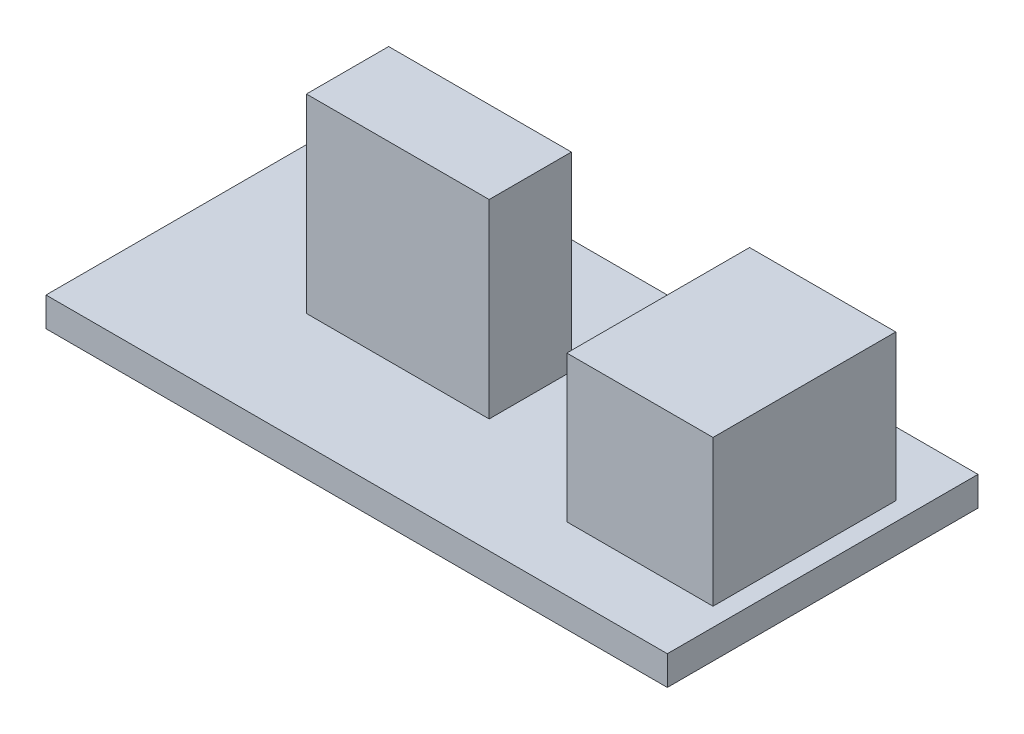
ISO-10303-21;
HEADER;
FILE_DESCRIPTION(('STEP AP214'),'2;1');
FILE_NAME('part.step','',(''),(''),'','','');
FILE_SCHEMA(('AUTOMOTIVE_DESIGN { 1 0 10303 214 1 1 1 1 }'));
ENDSEC;
DATA;
#1=APPLICATION_CONTEXT('core data for automotive mechanical design processes');
#2=APPLICATION_PROTOCOL_DEFINITION('international standard','automotive_design',2000,#1);
#3=PRODUCT_CONTEXT('',#1,'mechanical');
#4=PRODUCT('Part','Part','',(#3));
#5=PRODUCT_RELATED_PRODUCT_CATEGORY('part','',(#4));
#6=PRODUCT_DEFINITION_FORMATION('','',#4);
#7=PRODUCT_DEFINITION_CONTEXT('part definition',#1,'design');
#8=PRODUCT_DEFINITION('design','',#6,#7);
#9=PRODUCT_DEFINITION_SHAPE('','',#8);
#10=(LENGTH_UNIT() NAMED_UNIT(*) SI_UNIT(.MILLI.,.METRE.));
#11=(NAMED_UNIT(*) PLANE_ANGLE_UNIT() SI_UNIT($,.RADIAN.));
#12=(NAMED_UNIT(*) SI_UNIT($,.STERADIAN.) SOLID_ANGLE_UNIT());
#13=UNCERTAINTY_MEASURE_WITH_UNIT(LENGTH_MEASURE(1.E-05),#10,'distance_accuracy_value','');
#14=(GEOMETRIC_REPRESENTATION_CONTEXT(3) GLOBAL_UNCERTAINTY_ASSIGNED_CONTEXT((#13)) GLOBAL_UNIT_ASSIGNED_CONTEXT((#10,
#11,#12)) REPRESENTATION_CONTEXT('',''));
#15=CARTESIAN_POINT('',(0.,0.,0.));
#16=DIRECTION('',(0.,0.,1.));
#17=DIRECTION('',(1.,0.,0.));
#18=AXIS2_PLACEMENT_3D('',#15,#16,#17);
#19=CARTESIAN_POINT('',(0.,1.6,0.));
#20=DIRECTION('',(0.,-1.,0.));
#21=DIRECTION('',(0.,0.,-1.));
#22=AXIS2_PLACEMENT_3D('',#19,#20,#21);
#23=PLANE('',#22);
#24=DIRECTION('',(0.,0.,1.));
#25=VECTOR('',#24,1.);
#26=CARTESIAN_POINT('',(-9.,1.6,-2.25));
#27=LINE('',#26,#25);
#28=CARTESIAN_POINT('',(-9.,1.6,-2.25));
#29=VERTEX_POINT('',#28);
#30=CARTESIAN_POINT('',(-9.,1.6,2.25));
#31=VERTEX_POINT('',#30);
#32=EDGE_CURVE('E160',#29,#31,#27,.T.);
#33=ORIENTED_EDGE('',*,*,#32,.F.);
#34=DIRECTION('',(-1.,0.,0.));
#35=VECTOR('',#34,1.);
#36=CARTESIAN_POINT('',(1.,1.6,-2.25));
#37=LINE('',#36,#35);
#38=CARTESIAN_POINT('',(1.,1.6,-2.25));
#39=VERTEX_POINT('',#38);
#40=EDGE_CURVE('E168',#39,#29,#37,.T.);
#41=ORIENTED_EDGE('',*,*,#40,.F.);
#42=DIRECTION('',(0.,0.,-1.));
#43=VECTOR('',#42,1.);
#44=CARTESIAN_POINT('',(1.,1.6,2.25));
#45=LINE('',#44,#43);
#46=CARTESIAN_POINT('',(1.,1.6,2.25));
#47=VERTEX_POINT('',#46);
#48=EDGE_CURVE('E176',#47,#39,#45,.T.);
#49=ORIENTED_EDGE('',*,*,#48,.F.);
#50=DIRECTION('',(1.,0.,0.));
#51=VECTOR('',#50,1.);
#52=CARTESIAN_POINT('',(-9.,1.6,2.25));
#53=LINE('',#52,#51);
#54=EDGE_CURVE('E159',#31,#47,#53,.T.);
#55=ORIENTED_EDGE('',*,*,#54,.F.);
#56=EDGE_LOOP('',(#33,#41,#49,#55));
#57=FACE_BOUND('',#56,.T.);
#58=DIRECTION('',(0.,0.,-1.));
#59=VECTOR('',#58,1.);
#60=CARTESIAN_POINT('',(17.,1.6,8.5));
#61=LINE('',#60,#59);
#62=CARTESIAN_POINT('',(17.,1.6,8.5));
#63=VERTEX_POINT('',#62);
#64=CARTESIAN_POINT('',(17.,1.6,-8.5));
#65=VERTEX_POINT('',#64);
#66=EDGE_CURVE('E198',#63,#65,#61,.T.);
#67=ORIENTED_EDGE('',*,*,#66,.T.);
#68=DIRECTION('',(-1.,0.,0.));
#69=VECTOR('',#68,1.);
#70=CARTESIAN_POINT('',(-17.,1.6,-8.5));
#71=LINE('',#70,#69);
#72=CARTESIAN_POINT('',(-17.,1.6,-8.5));
#73=VERTEX_POINT('',#72);
#74=EDGE_CURVE('E200',#65,#73,#71,.T.);
#75=ORIENTED_EDGE('',*,*,#74,.T.);
#76=DIRECTION('',(0.,0.,1.));
#77=VECTOR('',#76,1.);
#78=CARTESIAN_POINT('',(-17.,1.6,8.5));
#79=LINE('',#78,#77);
#80=CARTESIAN_POINT('',(-17.,1.6,8.5));
#81=VERTEX_POINT('',#80);
#82=EDGE_CURVE('E205',#73,#81,#79,.T.);
#83=ORIENTED_EDGE('',*,*,#82,.T.);
#84=DIRECTION('',(1.,0.,0.));
#85=VECTOR('',#84,1.);
#86=CARTESIAN_POINT('',(-17.,1.6,8.5));
#87=LINE('',#86,#85);
#88=EDGE_CURVE('E204',#81,#63,#87,.T.);
#89=ORIENTED_EDGE('',*,*,#88,.T.);
#90=EDGE_LOOP('',(#67,#75,#83,#89));
#91=FACE_BOUND('',#90,.T.);
#92=DIRECTION('',(0.,0.,1.));
#93=VECTOR('',#92,1.);
#94=CARTESIAN_POINT('',(8.,1.6,-5.));
#95=LINE('',#94,#93);
#96=CARTESIAN_POINT('',(8.,1.6,-5.));
#97=VERTEX_POINT('',#96);
#98=CARTESIAN_POINT('',(8.,1.6,5.));
#99=VERTEX_POINT('',#98);
#100=EDGE_CURVE('E156',#97,#99,#95,.T.);
#101=ORIENTED_EDGE('',*,*,#100,.F.);
#102=DIRECTION('',(-1.,0.,0.));
#103=VECTOR('',#102,1.);
#104=CARTESIAN_POINT('',(16.,1.6,-5.));
#105=LINE('',#104,#103);
#106=CARTESIAN_POINT('',(16.,1.6,-5.));
#107=VERTEX_POINT('',#106);
#108=EDGE_CURVE('E153',#107,#97,#105,.T.);
#109=ORIENTED_EDGE('',*,*,#108,.F.);
#110=DIRECTION('',(0.,0.,-1.));
#111=VECTOR('',#110,1.);
#112=CARTESIAN_POINT('',(16.,1.6,5.));
#113=LINE('',#112,#111);
#114=CARTESIAN_POINT('',(16.,1.6,5.));
#115=VERTEX_POINT('',#114);
#116=EDGE_CURVE('E69',#115,#107,#113,.T.);
#117=ORIENTED_EDGE('',*,*,#116,.F.);
#118=DIRECTION('',(1.,0.,0.));
#119=VECTOR('',#118,1.);
#120=CARTESIAN_POINT('',(8.,1.6,5.));
#121=LINE('',#120,#119);
#122=EDGE_CURVE('E65',#99,#115,#121,.T.);
#123=ORIENTED_EDGE('',*,*,#122,.F.);
#124=EDGE_LOOP('',(#101,#109,#117,#123));
#125=FACE_BOUND('',#124,.T.);
#126=ADVANCED_FACE('F50',(#57,#91,#125),#23,.F.);
#127=CARTESIAN_POINT('',(17.,1.6,8.5));
#128=DIRECTION('',(-1.,0.,0.));
#129=DIRECTION('',(0.,0.,1.));
#130=AXIS2_PLACEMENT_3D('',#127,#128,#129);
#131=PLANE('',#130);
#132=DIRECTION('',(0.,0.,-1.));
#133=VECTOR('',#132,1.);
#134=CARTESIAN_POINT('',(17.,0.,8.5));
#135=LINE('',#134,#133);
#136=CARTESIAN_POINT('',(17.,0.,8.5));
#137=VERTEX_POINT('',#136);
#138=CARTESIAN_POINT('',(17.,0.,-8.5));
#139=VERTEX_POINT('',#138);
#140=EDGE_CURVE('E193',#137,#139,#135,.T.);
#141=ORIENTED_EDGE('',*,*,#140,.T.);
#142=DIRECTION('',(0.,-1.,0.));
#143=VECTOR('',#142,1.);
#144=CARTESIAN_POINT('',(17.,1.6,-8.5));
#145=LINE('',#144,#143);
#146=EDGE_CURVE('E11',#65,#139,#145,.T.);
#147=ORIENTED_EDGE('',*,*,#146,.F.);
#148=ORIENTED_EDGE('',*,*,#66,.F.);
#149=DIRECTION('',(0.,-1.,0.));
#150=VECTOR('',#149,1.);
#151=CARTESIAN_POINT('',(17.,1.6,8.5));
#152=LINE('',#151,#150);
#153=EDGE_CURVE('E206',#63,#137,#152,.T.);
#154=ORIENTED_EDGE('',*,*,#153,.T.);
#155=EDGE_LOOP('',(#141,#147,#148,#154));
#156=FACE_BOUND('',#155,.T.);
#157=ADVANCED_FACE('F47',(#156),#131,.F.);
#158=CARTESIAN_POINT('',(-17.,1.6,-8.5));
#159=DIRECTION('',(0.,0.,1.));
#160=DIRECTION('',(1.,0.,0.));
#161=AXIS2_PLACEMENT_3D('',#158,#159,#160);
#162=PLANE('',#161);
#163=DIRECTION('',(-1.,0.,0.));
#164=VECTOR('',#163,1.);
#165=CARTESIAN_POINT('',(-17.,0.,-8.5));
#166=LINE('',#165,#164);
#167=CARTESIAN_POINT('',(-17.,0.,-8.5));
#168=VERTEX_POINT('',#167);
#169=EDGE_CURVE('E207',#139,#168,#166,.T.);
#170=ORIENTED_EDGE('',*,*,#169,.T.);
#171=DIRECTION('',(0.,-1.,0.));
#172=VECTOR('',#171,1.);
#173=CARTESIAN_POINT('',(-17.,1.6,-8.5));
#174=LINE('',#173,#172);
#175=EDGE_CURVE('E54',#73,#168,#174,.T.);
#176=ORIENTED_EDGE('',*,*,#175,.F.);
#177=ORIENTED_EDGE('',*,*,#74,.F.);
#178=ORIENTED_EDGE('',*,*,#146,.T.);
#179=EDGE_LOOP('',(#170,#176,#177,#178));
#180=FACE_BOUND('',#179,.T.);
#181=ADVANCED_FACE('F236',(#180),#162,.F.);
#182=CARTESIAN_POINT('',(-17.,1.6,8.5));
#183=DIRECTION('',(1.,0.,0.));
#184=DIRECTION('',(0.,0.,-1.));
#185=AXIS2_PLACEMENT_3D('',#182,#183,#184);
#186=PLANE('',#185);
#187=DIRECTION('',(0.,0.,1.));
#188=VECTOR('',#187,1.);
#189=CARTESIAN_POINT('',(-17.,0.,8.5));
#190=LINE('',#189,#188);
#191=CARTESIAN_POINT('',(-17.,0.,8.5));
#192=VERTEX_POINT('',#191);
#193=EDGE_CURVE('E211',#168,#192,#190,.T.);
#194=ORIENTED_EDGE('',*,*,#193,.T.);
#195=DIRECTION('',(0.,-1.,0.));
#196=VECTOR('',#195,1.);
#197=CARTESIAN_POINT('',(-17.,1.6,8.5));
#198=LINE('',#197,#196);
#199=EDGE_CURVE('E216',#81,#192,#198,.T.);
#200=ORIENTED_EDGE('',*,*,#199,.F.);
#201=ORIENTED_EDGE('',*,*,#82,.F.);
#202=ORIENTED_EDGE('',*,*,#175,.T.);
#203=EDGE_LOOP('',(#194,#200,#201,#202));
#204=FACE_BOUND('',#203,.T.);
#205=ADVANCED_FACE('F224',(#204),#186,.F.);
#206=CARTESIAN_POINT('',(-17.,1.6,8.5));
#207=DIRECTION('',(0.,0.,-1.));
#208=DIRECTION('',(-1.,0.,0.));
#209=AXIS2_PLACEMENT_3D('',#206,#207,#208);
#210=PLANE('',#209);
#211=DIRECTION('',(1.,0.,0.));
#212=VECTOR('',#211,1.);
#213=CARTESIAN_POINT('',(-17.,0.,8.5));
#214=LINE('',#213,#212);
#215=EDGE_CURVE('E199',#192,#137,#214,.T.);
#216=ORIENTED_EDGE('',*,*,#215,.T.);
#217=ORIENTED_EDGE('',*,*,#153,.F.);
#218=ORIENTED_EDGE('',*,*,#88,.F.);
#219=ORIENTED_EDGE('',*,*,#199,.T.);
#220=EDGE_LOOP('',(#216,#217,#218,#219));
#221=FACE_BOUND('',#220,.T.);
#222=ADVANCED_FACE('F234',(#221),#210,.F.);
#223=CARTESIAN_POINT('',(0.,0.,0.));
#224=DIRECTION('',(0.,-1.,0.));
#225=DIRECTION('',(0.,0.,-1.));
#226=AXIS2_PLACEMENT_3D('',#223,#224,#225);
#227=PLANE('',#226);
#228=ORIENTED_EDGE('',*,*,#140,.F.);
#229=ORIENTED_EDGE('',*,*,#215,.F.);
#230=ORIENTED_EDGE('',*,*,#193,.F.);
#231=ORIENTED_EDGE('',*,*,#169,.F.);
#232=EDGE_LOOP('',(#228,#229,#230,#231));
#233=FACE_BOUND('',#232,.T.);
#234=ADVANCED_FACE('F229',(#233),#227,.T.);
#235=CARTESIAN_POINT('',(-9.,12.,-2.25));
#236=DIRECTION('',(1.,0.,0.));
#237=DIRECTION('',(0.,0.,-1.));
#238=AXIS2_PLACEMENT_3D('',#235,#236,#237);
#239=PLANE('',#238);
#240=ORIENTED_EDGE('',*,*,#32,.T.);
#241=DIRECTION('',(0.,-1.,0.));
#242=VECTOR('',#241,1.);
#243=CARTESIAN_POINT('',(-9.,12.,2.25));
#244=LINE('',#243,#242);
#245=CARTESIAN_POINT('',(-9.,12.,2.25));
#246=VERTEX_POINT('',#245);
#247=EDGE_CURVE('E194',#246,#31,#244,.T.);
#248=ORIENTED_EDGE('',*,*,#247,.F.);
#249=DIRECTION('',(0.,0.,1.));
#250=VECTOR('',#249,1.);
#251=CARTESIAN_POINT('',(-9.,12.,-2.25));
#252=LINE('',#251,#250);
#253=CARTESIAN_POINT('',(-9.,12.,-2.25));
#254=VERTEX_POINT('',#253);
#255=EDGE_CURVE('E167',#254,#246,#252,.T.);
#256=ORIENTED_EDGE('',*,*,#255,.F.);
#257=DIRECTION('',(0.,-1.,0.));
#258=VECTOR('',#257,1.);
#259=CARTESIAN_POINT('',(-9.,12.,-2.25));
#260=LINE('',#259,#258);
#261=EDGE_CURVE('E172',#254,#29,#260,.T.);
#262=ORIENTED_EDGE('',*,*,#261,.T.);
#263=EDGE_LOOP('',(#240,#248,#256,#262));
#264=FACE_BOUND('',#263,.T.);
#265=ADVANCED_FACE('F255',(#264),#239,.F.);
#266=CARTESIAN_POINT('',(-9.,12.,2.25));
#267=DIRECTION('',(0.,0.,-1.));
#268=DIRECTION('',(-1.,0.,0.));
#269=AXIS2_PLACEMENT_3D('',#266,#267,#268);
#270=PLANE('',#269);
#271=ORIENTED_EDGE('',*,*,#54,.T.);
#272=DIRECTION('',(0.,-1.,0.));
#273=VECTOR('',#272,1.);
#274=CARTESIAN_POINT('',(1.,12.,2.25));
#275=LINE('',#274,#273);
#276=CARTESIAN_POINT('',(1.,12.,2.25));
#277=VERTEX_POINT('',#276);
#278=EDGE_CURVE('E189',#277,#47,#275,.T.);
#279=ORIENTED_EDGE('',*,*,#278,.F.);
#280=DIRECTION('',(1.,0.,0.));
#281=VECTOR('',#280,1.);
#282=CARTESIAN_POINT('',(-9.,12.,2.25));
#283=LINE('',#282,#281);
#284=EDGE_CURVE('E166',#246,#277,#283,.T.);
#285=ORIENTED_EDGE('',*,*,#284,.F.);
#286=ORIENTED_EDGE('',*,*,#247,.T.);
#287=EDGE_LOOP('',(#271,#279,#285,#286));
#288=FACE_BOUND('',#287,.T.);
#289=ADVANCED_FACE('F280',(#288),#270,.F.);
#290=CARTESIAN_POINT('',(1.,12.,2.25));
#291=DIRECTION('',(-1.,0.,0.));
#292=DIRECTION('',(0.,0.,1.));
#293=AXIS2_PLACEMENT_3D('',#290,#291,#292);
#294=PLANE('',#293);
#295=ORIENTED_EDGE('',*,*,#48,.T.);
#296=DIRECTION('',(0.,-1.,0.));
#297=VECTOR('',#296,1.);
#298=CARTESIAN_POINT('',(1.,12.,-2.25));
#299=LINE('',#298,#297);
#300=CARTESIAN_POINT('',(1.,12.,-2.25));
#301=VERTEX_POINT('',#300);
#302=EDGE_CURVE('E188',#301,#39,#299,.T.);
#303=ORIENTED_EDGE('',*,*,#302,.F.);
#304=DIRECTION('',(0.,0.,-1.));
#305=VECTOR('',#304,1.);
#306=CARTESIAN_POINT('',(1.,12.,2.25));
#307=LINE('',#306,#305);
#308=EDGE_CURVE('E175',#277,#301,#307,.T.);
#309=ORIENTED_EDGE('',*,*,#308,.F.);
#310=ORIENTED_EDGE('',*,*,#278,.T.);
#311=EDGE_LOOP('',(#295,#303,#309,#310));
#312=FACE_BOUND('',#311,.T.);
#313=ADVANCED_FACE('F290',(#312),#294,.F.);
#314=CARTESIAN_POINT('',(1.,12.,-2.25));
#315=DIRECTION('',(0.,0.,1.));
#316=DIRECTION('',(1.,0.,0.));
#317=AXIS2_PLACEMENT_3D('',#314,#315,#316);
#318=PLANE('',#317);
#319=ORIENTED_EDGE('',*,*,#40,.T.);
#320=ORIENTED_EDGE('',*,*,#261,.F.);
#321=DIRECTION('',(-1.,0.,0.));
#322=VECTOR('',#321,1.);
#323=CARTESIAN_POINT('',(1.,12.,-2.25));
#324=LINE('',#323,#322);
#325=EDGE_CURVE('E174',#301,#254,#324,.T.);
#326=ORIENTED_EDGE('',*,*,#325,.F.);
#327=ORIENTED_EDGE('',*,*,#302,.T.);
#328=EDGE_LOOP('',(#319,#320,#326,#327));
#329=FACE_BOUND('',#328,.T.);
#330=ADVANCED_FACE('F299',(#329),#318,.F.);
#331=CARTESIAN_POINT('',(0.,12.,0.));
#332=DIRECTION('',(0.,1.,0.));
#333=DIRECTION('',(0.,0.,1.));
#334=AXIS2_PLACEMENT_3D('',#331,#332,#333);
#335=PLANE('',#334);
#336=ORIENTED_EDGE('',*,*,#255,.T.);
#337=ORIENTED_EDGE('',*,*,#284,.T.);
#338=ORIENTED_EDGE('',*,*,#308,.T.);
#339=ORIENTED_EDGE('',*,*,#325,.T.);
#340=EDGE_LOOP('',(#336,#337,#338,#339));
#341=FACE_BOUND('',#340,.T.);
#342=ADVANCED_FACE('F309',(#341),#335,.T.);
#343=CARTESIAN_POINT('',(8.,9.6,-5.));
#344=DIRECTION('',(1.,0.,0.));
#345=DIRECTION('',(0.,0.,-1.));
#346=AXIS2_PLACEMENT_3D('',#343,#344,#345);
#347=PLANE('',#346);
#348=ORIENTED_EDGE('',*,*,#100,.T.);
#349=DIRECTION('',(0.,-1.,0.));
#350=VECTOR('',#349,1.);
#351=CARTESIAN_POINT('',(8.,9.6,5.));
#352=LINE('',#351,#350);
#353=CARTESIAN_POINT('',(8.,9.6,5.));
#354=VERTEX_POINT('',#353);
#355=EDGE_CURVE('E139',#354,#99,#352,.T.);
#356=ORIENTED_EDGE('',*,*,#355,.F.);
#357=DIRECTION('',(0.,0.,1.));
#358=VECTOR('',#357,1.);
#359=CARTESIAN_POINT('',(8.,9.6,-5.));
#360=LINE('',#359,#358);
#361=CARTESIAN_POINT('',(8.,9.6,-5.));
#362=VERTEX_POINT('',#361);
#363=EDGE_CURVE('E145',#362,#354,#360,.T.);
#364=ORIENTED_EDGE('',*,*,#363,.F.);
#365=DIRECTION('',(0.,-1.,0.));
#366=VECTOR('',#365,1.);
#367=CARTESIAN_POINT('',(8.,9.6,-5.));
#368=LINE('',#367,#366);
#369=EDGE_CURVE('E416',#362,#97,#368,.T.);
#370=ORIENTED_EDGE('',*,*,#369,.T.);
#371=EDGE_LOOP('',(#348,#356,#364,#370));
#372=FACE_BOUND('',#371,.T.);
#373=ADVANCED_FACE('F154',(#372),#347,.F.);
#374=CARTESIAN_POINT('',(8.,9.6,5.));
#375=DIRECTION('',(0.,0.,-1.));
#376=DIRECTION('',(-1.,0.,0.));
#377=AXIS2_PLACEMENT_3D('',#374,#375,#376);
#378=PLANE('',#377);
#379=ORIENTED_EDGE('',*,*,#122,.T.);
#380=DIRECTION('',(0.,-1.,0.));
#381=VECTOR('',#380,1.);
#382=CARTESIAN_POINT('',(16.,9.6,5.));
#383=LINE('',#382,#381);
#384=CARTESIAN_POINT('',(16.,9.6,5.));
#385=VERTEX_POINT('',#384);
#386=EDGE_CURVE('E138',#385,#115,#383,.T.);
#387=ORIENTED_EDGE('',*,*,#386,.F.);
#388=DIRECTION('',(1.,0.,0.));
#389=VECTOR('',#388,1.);
#390=CARTESIAN_POINT('',(8.,9.6,5.));
#391=LINE('',#390,#389);
#392=EDGE_CURVE('E131',#354,#385,#391,.T.);
#393=ORIENTED_EDGE('',*,*,#392,.F.);
#394=ORIENTED_EDGE('',*,*,#355,.T.);
#395=EDGE_LOOP('',(#379,#387,#393,#394));
#396=FACE_BOUND('',#395,.T.);
#397=ADVANCED_FACE('F132',(#396),#378,.F.);
#398=CARTESIAN_POINT('',(16.,9.6,5.));
#399=DIRECTION('',(-1.,0.,0.));
#400=DIRECTION('',(0.,0.,1.));
#401=AXIS2_PLACEMENT_3D('',#398,#399,#400);
#402=PLANE('',#401);
#403=ORIENTED_EDGE('',*,*,#116,.T.);
#404=DIRECTION('',(0.,-1.,0.));
#405=VECTOR('',#404,1.);
#406=CARTESIAN_POINT('',(16.,9.6,-5.));
#407=LINE('',#406,#405);
#408=CARTESIAN_POINT('',(16.,9.6,-5.));
#409=VERTEX_POINT('',#408);
#410=EDGE_CURVE('E165',#409,#107,#407,.T.);
#411=ORIENTED_EDGE('',*,*,#410,.F.);
#412=DIRECTION('',(0.,0.,-1.));
#413=VECTOR('',#412,1.);
#414=CARTESIAN_POINT('',(16.,9.6,5.));
#415=LINE('',#414,#413);
#416=EDGE_CURVE('E141',#385,#409,#415,.T.);
#417=ORIENTED_EDGE('',*,*,#416,.F.);
#418=ORIENTED_EDGE('',*,*,#386,.T.);
#419=EDGE_LOOP('',(#403,#411,#417,#418));
#420=FACE_BOUND('',#419,.T.);
#421=ADVANCED_FACE('F337',(#420),#402,.F.);
#422=CARTESIAN_POINT('',(16.,9.6,-5.));
#423=DIRECTION('',(0.,0.,1.));
#424=DIRECTION('',(1.,0.,0.));
#425=AXIS2_PLACEMENT_3D('',#422,#423,#424);
#426=PLANE('',#425);
#427=ORIENTED_EDGE('',*,*,#108,.T.);
#428=ORIENTED_EDGE('',*,*,#369,.F.);
#429=DIRECTION('',(-1.,0.,0.));
#430=VECTOR('',#429,1.);
#431=CARTESIAN_POINT('',(16.,9.6,-5.));
#432=LINE('',#431,#430);
#433=EDGE_CURVE('E149',#409,#362,#432,.T.);
#434=ORIENTED_EDGE('',*,*,#433,.F.);
#435=ORIENTED_EDGE('',*,*,#410,.T.);
#436=EDGE_LOOP('',(#427,#428,#434,#435));
#437=FACE_BOUND('',#436,.T.);
#438=ADVANCED_FACE('F349',(#437),#426,.F.);
#439=CARTESIAN_POINT('',(0.,9.6,0.));
#440=DIRECTION('',(0.,1.,0.));
#441=DIRECTION('',(0.,0.,1.));
#442=AXIS2_PLACEMENT_3D('',#439,#440,#441);
#443=PLANE('',#442);
#444=ORIENTED_EDGE('',*,*,#363,.T.);
#445=ORIENTED_EDGE('',*,*,#392,.T.);
#446=ORIENTED_EDGE('',*,*,#416,.T.);
#447=ORIENTED_EDGE('',*,*,#433,.T.);
#448=EDGE_LOOP('',(#444,#445,#446,#447));
#449=FACE_BOUND('',#448,.T.);
#450=ADVANCED_FACE('F150',(#449),#443,.T.);
#451=CLOSED_SHELL('',(#126,#157,#181,#205,#222,#234,#265,#289,#313,#330,#342,#373,#397,#421,
#438,#450));
#452=MANIFOLD_SOLID_BREP('B2',#451);
#453=ADVANCED_BREP_SHAPE_REPRESENTATION('',(#18,#452),#14);
#454=SHAPE_DEFINITION_REPRESENTATION(#9,#453);
ENDSEC;
END-ISO-10303-21;
